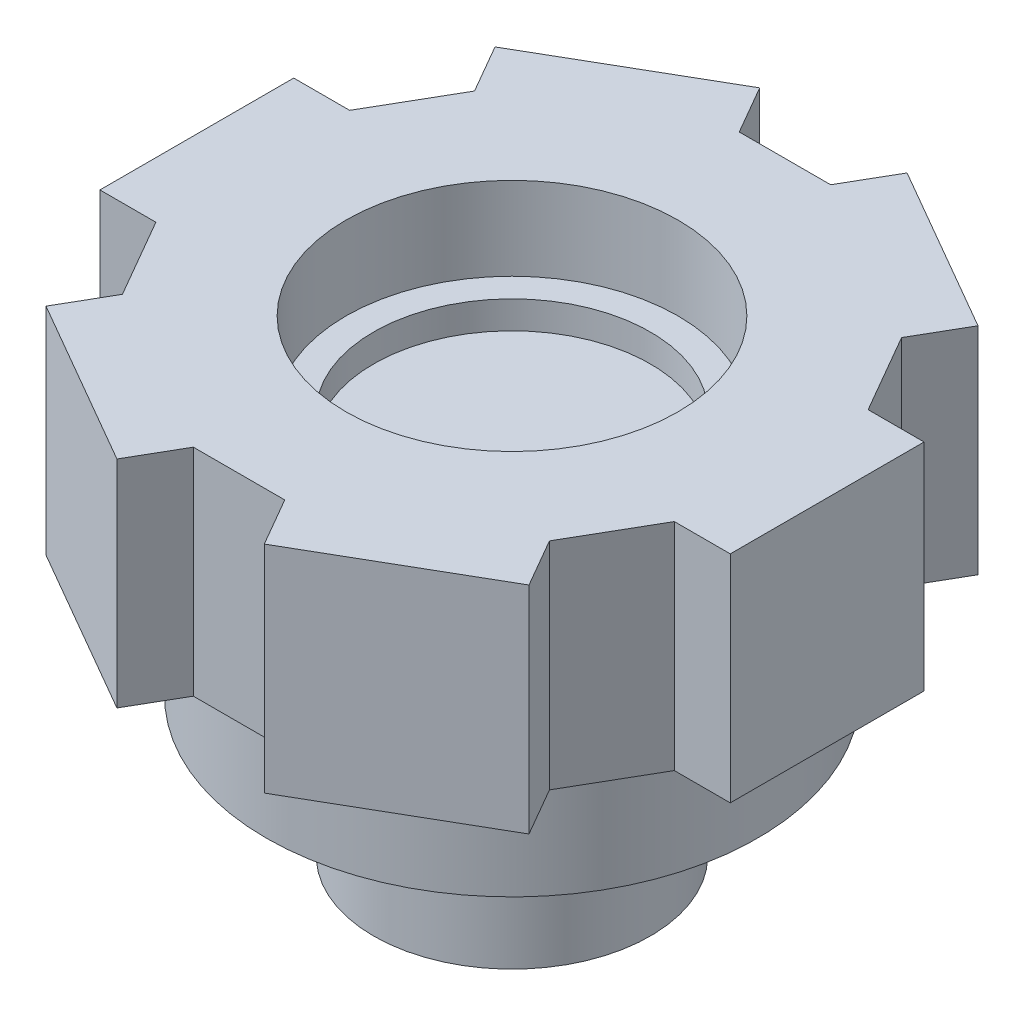
ISO-10303-21;
HEADER;
FILE_DESCRIPTION(('STEP AP214'),'2;1');
FILE_NAME('part.step','',(''),(''),'','','');
FILE_SCHEMA(('AUTOMOTIVE_DESIGN { 1 0 10303 214 1 1 1 1 }'));
ENDSEC;
DATA;
#1=APPLICATION_CONTEXT('core data for automotive mechanical design processes');
#2=APPLICATION_PROTOCOL_DEFINITION('international standard','automotive_design',2000,#1);
#3=PRODUCT_CONTEXT('',#1,'mechanical');
#4=PRODUCT('Part','Part','',(#3));
#5=PRODUCT_RELATED_PRODUCT_CATEGORY('part','',(#4));
#6=PRODUCT_DEFINITION_FORMATION('','',#4);
#7=PRODUCT_DEFINITION_CONTEXT('part definition',#1,'design');
#8=PRODUCT_DEFINITION('design','',#6,#7);
#9=PRODUCT_DEFINITION_SHAPE('','',#8);
#10=(LENGTH_UNIT() NAMED_UNIT(*) SI_UNIT(.MILLI.,.METRE.));
#11=(NAMED_UNIT(*) PLANE_ANGLE_UNIT() SI_UNIT($,.RADIAN.));
#12=(NAMED_UNIT(*) SI_UNIT($,.STERADIAN.) SOLID_ANGLE_UNIT());
#13=UNCERTAINTY_MEASURE_WITH_UNIT(LENGTH_MEASURE(1.E-05),#10,'distance_accuracy_value','');
#14=(GEOMETRIC_REPRESENTATION_CONTEXT(3) GLOBAL_UNCERTAINTY_ASSIGNED_CONTEXT((#13)) GLOBAL_UNIT_ASSIGNED_CONTEXT((#10,
#11,#12)) REPRESENTATION_CONTEXT('',''));
#15=CARTESIAN_POINT('',(0.,0.,0.));
#16=DIRECTION('',(0.,0.,1.));
#17=DIRECTION('',(1.,0.,0.));
#18=AXIS2_PLACEMENT_3D('',#15,#16,#17);
#19=CARTESIAN_POINT('',(0.,5.,0.));
#20=DIRECTION('',(0.,-1.,0.));
#21=DIRECTION('',(0.,0.,-1.));
#22=AXIS2_PLACEMENT_3D('',#19,#20,#21);
#23=CYLINDRICAL_SURFACE('',#22,5.);
#24=CARTESIAN_POINT('',(0.,5.,0.));
#25=DIRECTION('',(0.,1.,0.));
#26=DIRECTION('',(0.,0.,1.));
#27=AXIS2_PLACEMENT_3D('',#24,#25,#26);
#28=CIRCLE('',#27,5.);
#29=CARTESIAN_POINT('',(0.,5.,5.));
#30=VERTEX_POINT('',#29);
#31=EDGE_CURVE('E11',#30,#30,#28,.T.);
#32=ORIENTED_EDGE('',*,*,#31,.F.);
#33=EDGE_LOOP('',(#32));
#34=FACE_BOUND('',#33,.T.);
#35=CARTESIAN_POINT('',(0.,0.,0.));
#36=DIRECTION('',(0.,1.,0.));
#37=DIRECTION('',(0.,0.,1.));
#38=AXIS2_PLACEMENT_3D('',#35,#36,#37);
#39=CIRCLE('',#38,5.);
#40=CARTESIAN_POINT('',(0.,0.,5.));
#41=VERTEX_POINT('',#40);
#42=EDGE_CURVE('E36',#41,#41,#39,.T.);
#43=ORIENTED_EDGE('',*,*,#42,.T.);
#44=EDGE_LOOP('',(#43));
#45=FACE_BOUND('',#44,.T.);
#46=ADVANCED_FACE('F33',(#34,#45),#23,.T.);
#47=CARTESIAN_POINT('',(0.,0.,0.));
#48=DIRECTION('',(0.,1.,0.));
#49=DIRECTION('',(0.,0.,1.));
#50=AXIS2_PLACEMENT_3D('',#47,#48,#49);
#51=PLANE('',#50);
#52=ORIENTED_EDGE('',*,*,#42,.F.);
#53=EDGE_LOOP('',(#52));
#54=FACE_BOUND('',#53,.T.);
#55=ADVANCED_FACE('F357',(#54),#51,.F.);
#56=CARTESIAN_POINT('',(0.,9.11,0.));
#57=DIRECTION('',(0.,-1.,0.));
#58=DIRECTION('',(0.,0.,-1.));
#59=AXIS2_PLACEMENT_3D('',#56,#57,#58);
#60=CYLINDRICAL_SURFACE('',#59,8.875);
#61=CARTESIAN_POINT('',(0.,9.11,0.));
#62=DIRECTION('',(0.,1.,0.));
#63=DIRECTION('',(0.,0.,1.));
#64=AXIS2_PLACEMENT_3D('',#61,#62,#63);
#65=CIRCLE('',#64,8.875);
#66=CARTESIAN_POINT('',(0.,9.11,8.875));
#67=VERTEX_POINT('',#66);
#68=EDGE_CURVE('E337',#67,#67,#65,.T.);
#69=ORIENTED_EDGE('',*,*,#68,.F.);
#70=EDGE_LOOP('',(#69));
#71=FACE_BOUND('',#70,.T.);
#72=CARTESIAN_POINT('',(0.,5.,0.));
#73=DIRECTION('',(0.,1.,0.));
#74=DIRECTION('',(0.,0.,1.));
#75=AXIS2_PLACEMENT_3D('',#72,#73,#74);
#76=CIRCLE('',#75,8.875);
#77=CARTESIAN_POINT('',(0.,5.,8.875));
#78=VERTEX_POINT('',#77);
#79=EDGE_CURVE('E336',#78,#78,#76,.T.);
#80=ORIENTED_EDGE('',*,*,#79,.T.);
#81=EDGE_LOOP('',(#80));
#82=FACE_BOUND('',#81,.T.);
#83=ADVANCED_FACE('F343',(#71,#82),#60,.T.);
#84=CARTESIAN_POINT('',(0.,5.,0.));
#85=DIRECTION('',(0.,1.,0.));
#86=DIRECTION('',(0.,0.,1.));
#87=AXIS2_PLACEMENT_3D('',#84,#85,#86);
#88=PLANE('',#87);
#89=ORIENTED_EDGE('',*,*,#31,.T.);
#90=EDGE_LOOP('',(#89));
#91=FACE_BOUND('',#90,.T.);
#92=ORIENTED_EDGE('',*,*,#79,.F.);
#93=EDGE_LOOP('',(#92));
#94=FACE_BOUND('',#93,.T.);
#95=ADVANCED_FACE('F345',(#91,#94),#88,.F.);
#96=CARTESIAN_POINT('',(9.36427405783631,16.9,-3.5));
#97=DIRECTION('',(-0.866025403784439,0.,0.5));
#98=DIRECTION('',(0.5,0.,0.866025403784439));
#99=AXIS2_PLACEMENT_3D('',#96,#97,#98);
#100=PLANE('',#99);
#101=DIRECTION('',(-0.5,0.,-0.866025403784439));
#102=VECTOR('',#101,1.);
#103=CARTESIAN_POINT('',(9.36427405783631,9.11,-3.5));
#104=LINE('',#103,#102);
#105=CARTESIAN_POINT('',(9.36427405783631,9.11,-3.5));
#106=VERTEX_POINT('',#105);
#107=CARTESIAN_POINT('',(7.71322594216369,9.11,-6.35969922208584));
#108=VERTEX_POINT('',#107);
#109=EDGE_CURVE('E226',#106,#108,#104,.T.);
#110=ORIENTED_EDGE('',*,*,#109,.T.);
#111=DIRECTION('',(0.,-1.,0.));
#112=VECTOR('',#111,1.);
#113=CARTESIAN_POINT('',(7.71322594216369,16.9,-6.35969922208584));
#114=LINE('',#113,#112);
#115=CARTESIAN_POINT('',(7.71322594216369,16.9,-6.35969922208584));
#116=VERTEX_POINT('',#115);
#117=EDGE_CURVE('E334',#116,#108,#114,.T.);
#118=ORIENTED_EDGE('',*,*,#117,.F.);
#119=DIRECTION('',(-0.5,0.,-0.866025403784439));
#120=VECTOR('',#119,1.);
#121=CARTESIAN_POINT('',(9.36427405783631,16.9,-3.5));
#122=LINE('',#121,#120);
#123=CARTESIAN_POINT('',(9.36427405783631,16.9,-3.5));
#124=VERTEX_POINT('',#123);
#125=EDGE_CURVE('E273',#124,#116,#122,.T.);
#126=ORIENTED_EDGE('',*,*,#125,.F.);
#127=DIRECTION('',(0.,-1.,0.));
#128=VECTOR('',#127,1.);
#129=CARTESIAN_POINT('',(9.36427405783631,16.9,-3.5));
#130=LINE('',#129,#128);
#131=EDGE_CURVE('E222',#124,#106,#130,.T.);
#132=ORIENTED_EDGE('',*,*,#131,.T.);
#133=EDGE_LOOP('',(#110,#118,#126,#132));
#134=FACE_BOUND('',#133,.T.);
#135=ADVANCED_FACE('F347',(#134),#100,.F.);
#136=CARTESIAN_POINT('',(8.72358891324553,16.9,-8.10969922208584));
#137=DIRECTION('',(-0.866025403784438,0.,-0.5));
#138=DIRECTION('',(-0.5,0.,0.866025403784439));
#139=AXIS2_PLACEMENT_3D('',#136,#137,#138);
#140=PLANE('',#139);
#141=DIRECTION('',(0.5,0.,-0.866025403784438));
#142=VECTOR('',#141,1.);
#143=CARTESIAN_POINT('',(8.72358891324553,9.11,-8.10969922208584));
#144=LINE('',#143,#142);
#145=CARTESIAN_POINT('',(8.72358891324553,9.11,-8.10969922208584));
#146=VERTEX_POINT('',#145);
#147=EDGE_CURVE('E229',#108,#146,#144,.T.);
#148=ORIENTED_EDGE('',*,*,#147,.T.);
#149=DIRECTION('',(0.,-1.,0.));
#150=VECTOR('',#149,1.);
#151=CARTESIAN_POINT('',(8.72358891324553,16.9,-8.10969922208584));
#152=LINE('',#151,#150);
#153=CARTESIAN_POINT('',(8.72358891324553,16.9,-8.10969922208584));
#154=VERTEX_POINT('',#153);
#155=EDGE_CURVE('E331',#154,#146,#152,.T.);
#156=ORIENTED_EDGE('',*,*,#155,.F.);
#157=DIRECTION('',(0.5,0.,-0.866025403784438));
#158=VECTOR('',#157,1.);
#159=CARTESIAN_POINT('',(8.72358891324553,16.9,-8.10969922208584));
#160=LINE('',#159,#158);
#161=EDGE_CURVE('E141',#116,#154,#160,.T.);
#162=ORIENTED_EDGE('',*,*,#161,.F.);
#163=ORIENTED_EDGE('',*,*,#117,.T.);
#164=EDGE_LOOP('',(#148,#156,#162,#163));
#165=FACE_BOUND('',#164,.T.);
#166=ADVANCED_FACE('F354',(#165),#140,.F.);
#167=CARTESIAN_POINT('',(2.66141108675446,16.9,-11.6096992220858));
#168=DIRECTION('',(-0.499999999999999,0.,0.866025403784439));
#169=DIRECTION('',(0.866025403784439,0.,0.499999999999999));
#170=AXIS2_PLACEMENT_3D('',#167,#168,#169);
#171=PLANE('',#170);
#172=DIRECTION('',(-0.866025403784439,0.,-0.499999999999999));
#173=VECTOR('',#172,1.);
#174=CARTESIAN_POINT('',(2.66141108675446,9.11,-11.6096992220858));
#175=LINE('',#174,#173);
#176=CARTESIAN_POINT('',(2.66141108675446,9.11,-11.6096992220858));
#177=VERTEX_POINT('',#176);
#178=EDGE_CURVE('E232',#146,#177,#175,.T.);
#179=ORIENTED_EDGE('',*,*,#178,.T.);
#180=DIRECTION('',(0.,-1.,0.));
#181=VECTOR('',#180,1.);
#182=CARTESIAN_POINT('',(2.66141108675446,16.9,-11.6096992220858));
#183=LINE('',#182,#181);
#184=CARTESIAN_POINT('',(2.66141108675446,16.9,-11.6096992220858));
#185=VERTEX_POINT('',#184);
#186=EDGE_CURVE('E328',#185,#177,#183,.T.);
#187=ORIENTED_EDGE('',*,*,#186,.F.);
#188=DIRECTION('',(-0.866025403784439,0.,-0.499999999999999));
#189=VECTOR('',#188,1.);
#190=CARTESIAN_POINT('',(2.66141108675446,16.9,-11.6096992220858));
#191=LINE('',#190,#189);
#192=EDGE_CURVE('E687',#154,#185,#191,.T.);
#193=ORIENTED_EDGE('',*,*,#192,.F.);
#194=ORIENTED_EDGE('',*,*,#155,.T.);
#195=EDGE_LOOP('',(#179,#187,#193,#194));
#196=FACE_BOUND('',#195,.T.);
#197=ADVANCED_FACE('F395',(#196),#171,.F.);
#198=CARTESIAN_POINT('',(1.65104811567262,16.9,-9.85969922208584));
#199=DIRECTION('',(0.866025403784439,0.,0.499999999999999));
#200=DIRECTION('',(0.499999999999999,0.,-0.866025403784439));
#201=AXIS2_PLACEMENT_3D('',#198,#199,#200);
#202=PLANE('',#201);
#203=DIRECTION('',(-0.499999999999999,0.,0.866025403784439));
#204=VECTOR('',#203,1.);
#205=CARTESIAN_POINT('',(1.65104811567262,9.11,-9.85969922208584));
#206=LINE('',#205,#204);
#207=CARTESIAN_POINT('',(1.65104811567262,9.11,-9.85969922208584));
#208=VERTEX_POINT('',#207);
#209=EDGE_CURVE('E234',#177,#208,#206,.T.);
#210=ORIENTED_EDGE('',*,*,#209,.T.);
#211=DIRECTION('',(0.,-1.,0.));
#212=VECTOR('',#211,1.);
#213=CARTESIAN_POINT('',(1.65104811567262,16.9,-9.85969922208584));
#214=LINE('',#213,#212);
#215=CARTESIAN_POINT('',(1.65104811567262,16.9,-9.85969922208584));
#216=VERTEX_POINT('',#215);
#217=EDGE_CURVE('E325',#216,#208,#214,.T.);
#218=ORIENTED_EDGE('',*,*,#217,.F.);
#219=DIRECTION('',(-0.499999999999999,0.,0.866025403784439));
#220=VECTOR('',#219,1.);
#221=CARTESIAN_POINT('',(1.65104811567262,16.9,-9.85969922208584));
#222=LINE('',#221,#220);
#223=EDGE_CURVE('E689',#185,#216,#222,.T.);
#224=ORIENTED_EDGE('',*,*,#223,.F.);
#225=ORIENTED_EDGE('',*,*,#186,.T.);
#226=EDGE_LOOP('',(#210,#218,#224,#225));
#227=FACE_BOUND('',#226,.T.);
#228=ADVANCED_FACE('F404',(#227),#202,.F.);
#229=CARTESIAN_POINT('',(1.65104811567262,16.9,-9.85969922208584));
#230=DIRECTION('',(0.,0.,1.));
#231=DIRECTION('',(1.,0.,0.));
#232=AXIS2_PLACEMENT_3D('',#229,#230,#231);
#233=PLANE('',#232);
#234=DIRECTION('',(-1.,0.,0.));
#235=VECTOR('',#234,1.);
#236=CARTESIAN_POINT('',(1.65104811567262,9.11,-9.85969922208584));
#237=LINE('',#236,#235);
#238=CARTESIAN_POINT('',(-1.65104811567262,9.11,-9.85969922208584));
#239=VERTEX_POINT('',#238);
#240=EDGE_CURVE('E236',#208,#239,#237,.T.);
#241=ORIENTED_EDGE('',*,*,#240,.T.);
#242=DIRECTION('',(0.,-1.,0.));
#243=VECTOR('',#242,1.);
#244=CARTESIAN_POINT('',(-1.65104811567262,16.9,-9.85969922208584));
#245=LINE('',#244,#243);
#246=CARTESIAN_POINT('',(-1.65104811567262,16.9,-9.85969922208584));
#247=VERTEX_POINT('',#246);
#248=EDGE_CURVE('E322',#247,#239,#245,.T.);
#249=ORIENTED_EDGE('',*,*,#248,.F.);
#250=DIRECTION('',(-1.,0.,0.));
#251=VECTOR('',#250,1.);
#252=CARTESIAN_POINT('',(1.65104811567262,16.9,-9.85969922208584));
#253=LINE('',#252,#251);
#254=EDGE_CURVE('E691',#216,#247,#253,.T.);
#255=ORIENTED_EDGE('',*,*,#254,.F.);
#256=ORIENTED_EDGE('',*,*,#217,.T.);
#257=EDGE_LOOP('',(#241,#249,#255,#256));
#258=FACE_BOUND('',#257,.T.);
#259=ADVANCED_FACE('F414',(#258),#233,.F.);
#260=CARTESIAN_POINT('',(-2.66141108675446,16.9,-11.6096992220858));
#261=DIRECTION('',(-0.866025403784438,0.,0.5));
#262=DIRECTION('',(0.5,0.,0.866025403784438));
#263=AXIS2_PLACEMENT_3D('',#260,#261,#262);
#264=PLANE('',#263);
#265=DIRECTION('',(-0.5,0.,-0.866025403784438));
#266=VECTOR('',#265,1.);
#267=CARTESIAN_POINT('',(-2.66141108675446,9.11,-11.6096992220858));
#268=LINE('',#267,#266);
#269=CARTESIAN_POINT('',(-2.66141108675446,9.11,-11.6096992220858));
#270=VERTEX_POINT('',#269);
#271=EDGE_CURVE('E238',#239,#270,#268,.T.);
#272=ORIENTED_EDGE('',*,*,#271,.T.);
#273=DIRECTION('',(0.,-1.,0.));
#274=VECTOR('',#273,1.);
#275=CARTESIAN_POINT('',(-2.66141108675446,16.9,-11.6096992220858));
#276=LINE('',#275,#274);
#277=CARTESIAN_POINT('',(-2.66141108675446,16.9,-11.6096992220858));
#278=VERTEX_POINT('',#277);
#279=EDGE_CURVE('E319',#278,#270,#276,.T.);
#280=ORIENTED_EDGE('',*,*,#279,.F.);
#281=DIRECTION('',(-0.5,0.,-0.866025403784438));
#282=VECTOR('',#281,1.);
#283=CARTESIAN_POINT('',(-2.66141108675446,16.9,-11.6096992220858));
#284=LINE('',#283,#282);
#285=EDGE_CURVE('E693',#247,#278,#284,.T.);
#286=ORIENTED_EDGE('',*,*,#285,.F.);
#287=ORIENTED_EDGE('',*,*,#248,.T.);
#288=EDGE_LOOP('',(#272,#280,#286,#287));
#289=FACE_BOUND('',#288,.T.);
#290=ADVANCED_FACE('F424',(#289),#264,.F.);
#291=CARTESIAN_POINT('',(-8.72358891324553,16.9,-8.10969922208583));
#292=DIRECTION('',(0.5,0.,0.866025403784438));
#293=DIRECTION('',(0.866025403784438,0.,-0.5));
#294=AXIS2_PLACEMENT_3D('',#291,#292,#293);
#295=PLANE('',#294);
#296=DIRECTION('',(-0.866025403784438,0.,0.5));
#297=VECTOR('',#296,1.);
#298=CARTESIAN_POINT('',(-8.72358891324553,9.11,-8.10969922208583));
#299=LINE('',#298,#297);
#300=CARTESIAN_POINT('',(-8.72358891324553,9.11,-8.10969922208583));
#301=VERTEX_POINT('',#300);
#302=EDGE_CURVE('E240',#270,#301,#299,.T.);
#303=ORIENTED_EDGE('',*,*,#302,.T.);
#304=DIRECTION('',(0.,-1.,0.));
#305=VECTOR('',#304,1.);
#306=CARTESIAN_POINT('',(-8.72358891324553,16.9,-8.10969922208583));
#307=LINE('',#306,#305);
#308=CARTESIAN_POINT('',(-8.72358891324553,16.9,-8.10969922208583));
#309=VERTEX_POINT('',#308);
#310=EDGE_CURVE('E316',#309,#301,#307,.T.);
#311=ORIENTED_EDGE('',*,*,#310,.F.);
#312=DIRECTION('',(-0.866025403784438,0.,0.5));
#313=VECTOR('',#312,1.);
#314=CARTESIAN_POINT('',(-8.72358891324553,16.9,-8.10969922208583));
#315=LINE('',#314,#313);
#316=EDGE_CURVE('E695',#278,#309,#315,.T.);
#317=ORIENTED_EDGE('',*,*,#316,.F.);
#318=ORIENTED_EDGE('',*,*,#279,.T.);
#319=EDGE_LOOP('',(#303,#311,#317,#318));
#320=FACE_BOUND('',#319,.T.);
#321=ADVANCED_FACE('F434',(#320),#295,.F.);
#322=CARTESIAN_POINT('',(-7.71322594216369,16.9,-6.35969922208584));
#323=DIRECTION('',(0.866025403784438,0.,-0.500000000000001));
#324=DIRECTION('',(-0.500000000000001,0.,-0.866025403784438));
#325=AXIS2_PLACEMENT_3D('',#322,#323,#324);
#326=PLANE('',#325);
#327=DIRECTION('',(0.500000000000001,0.,0.866025403784438));
#328=VECTOR('',#327,1.);
#329=CARTESIAN_POINT('',(-7.71322594216369,9.11,-6.35969922208584));
#330=LINE('',#329,#328);
#331=CARTESIAN_POINT('',(-7.71322594216369,9.11,-6.35969922208584));
#332=VERTEX_POINT('',#331);
#333=EDGE_CURVE('E242',#301,#332,#330,.T.);
#334=ORIENTED_EDGE('',*,*,#333,.T.);
#335=DIRECTION('',(0.,-1.,0.));
#336=VECTOR('',#335,1.);
#337=CARTESIAN_POINT('',(-7.71322594216369,16.9,-6.35969922208584));
#338=LINE('',#337,#336);
#339=CARTESIAN_POINT('',(-7.71322594216369,16.9,-6.35969922208584));
#340=VERTEX_POINT('',#339);
#341=EDGE_CURVE('E313',#340,#332,#338,.T.);
#342=ORIENTED_EDGE('',*,*,#341,.F.);
#343=DIRECTION('',(0.500000000000001,0.,0.866025403784438));
#344=VECTOR('',#343,1.);
#345=CARTESIAN_POINT('',(-7.71322594216369,16.9,-6.35969922208584));
#346=LINE('',#345,#344);
#347=EDGE_CURVE('E697',#309,#340,#346,.T.);
#348=ORIENTED_EDGE('',*,*,#347,.F.);
#349=ORIENTED_EDGE('',*,*,#310,.T.);
#350=EDGE_LOOP('',(#334,#342,#348,#349));
#351=FACE_BOUND('',#350,.T.);
#352=ADVANCED_FACE('F444',(#351),#326,.F.);
#353=CARTESIAN_POINT('',(-7.71322594216369,16.9,-6.35969922208584));
#354=DIRECTION('',(0.866025403784439,0.,0.5));
#355=DIRECTION('',(0.5,0.,-0.866025403784439));
#356=AXIS2_PLACEMENT_3D('',#353,#354,#355);
#357=PLANE('',#356);
#358=DIRECTION('',(-0.5,0.,0.866025403784439));
#359=VECTOR('',#358,1.);
#360=CARTESIAN_POINT('',(-7.71322594216369,9.11,-6.35969922208584));
#361=LINE('',#360,#359);
#362=CARTESIAN_POINT('',(-9.36427405783631,9.11,-3.50000000000001));
#363=VERTEX_POINT('',#362);
#364=EDGE_CURVE('E244',#332,#363,#361,.T.);
#365=ORIENTED_EDGE('',*,*,#364,.T.);
#366=DIRECTION('',(0.,-1.,0.));
#367=VECTOR('',#366,1.);
#368=CARTESIAN_POINT('',(-9.36427405783631,16.9,-3.50000000000001));
#369=LINE('',#368,#367);
#370=CARTESIAN_POINT('',(-9.36427405783631,16.9,-3.50000000000001));
#371=VERTEX_POINT('',#370);
#372=EDGE_CURVE('E310',#371,#363,#369,.T.);
#373=ORIENTED_EDGE('',*,*,#372,.F.);
#374=DIRECTION('',(-0.5,0.,0.866025403784439));
#375=VECTOR('',#374,1.);
#376=CARTESIAN_POINT('',(-7.71322594216369,16.9,-6.35969922208584));
#377=LINE('',#376,#375);
#378=EDGE_CURVE('E699',#340,#371,#377,.T.);
#379=ORIENTED_EDGE('',*,*,#378,.F.);
#380=ORIENTED_EDGE('',*,*,#341,.T.);
#381=EDGE_LOOP('',(#365,#373,#379,#380));
#382=FACE_BOUND('',#381,.T.);
#383=ADVANCED_FACE('F454',(#382),#357,.F.);
#384=CARTESIAN_POINT('',(-11.385,16.9,-3.50000000000001));
#385=DIRECTION('',(0.,0.,1.));
#386=DIRECTION('',(1.,0.,0.));
#387=AXIS2_PLACEMENT_3D('',#384,#385,#386);
#388=PLANE('',#387);
#389=DIRECTION('',(-1.,0.,0.));
#390=VECTOR('',#389,1.);
#391=CARTESIAN_POINT('',(-11.385,9.11,-3.50000000000001));
#392=LINE('',#391,#390);
#393=CARTESIAN_POINT('',(-11.385,9.11,-3.50000000000001));
#394=VERTEX_POINT('',#393);
#395=EDGE_CURVE('E246',#363,#394,#392,.T.);
#396=ORIENTED_EDGE('',*,*,#395,.T.);
#397=DIRECTION('',(0.,-1.,0.));
#398=VECTOR('',#397,1.);
#399=CARTESIAN_POINT('',(-11.385,16.9,-3.50000000000001));
#400=LINE('',#399,#398);
#401=CARTESIAN_POINT('',(-11.385,16.9,-3.50000000000001));
#402=VERTEX_POINT('',#401);
#403=EDGE_CURVE('E307',#402,#394,#400,.T.);
#404=ORIENTED_EDGE('',*,*,#403,.F.);
#405=DIRECTION('',(-1.,0.,0.));
#406=VECTOR('',#405,1.);
#407=CARTESIAN_POINT('',(-11.385,16.9,-3.50000000000001));
#408=LINE('',#407,#406);
#409=EDGE_CURVE('E701',#371,#402,#408,.T.);
#410=ORIENTED_EDGE('',*,*,#409,.F.);
#411=ORIENTED_EDGE('',*,*,#372,.T.);
#412=EDGE_LOOP('',(#396,#404,#410,#411));
#413=FACE_BOUND('',#412,.T.);
#414=ADVANCED_FACE('F464',(#413),#388,.F.);
#415=CARTESIAN_POINT('',(-11.385,16.9,3.49999999999999));
#416=DIRECTION('',(1.,0.,0.));
#417=DIRECTION('',(0.,0.,-1.));
#418=AXIS2_PLACEMENT_3D('',#415,#416,#417);
#419=PLANE('',#418);
#420=DIRECTION('',(0.,0.,1.));
#421=VECTOR('',#420,1.);
#422=CARTESIAN_POINT('',(-11.385,9.11,3.49999999999999));
#423=LINE('',#422,#421);
#424=CARTESIAN_POINT('',(-11.385,9.11,3.49999999999999));
#425=VERTEX_POINT('',#424);
#426=EDGE_CURVE('E248',#394,#425,#423,.T.);
#427=ORIENTED_EDGE('',*,*,#426,.T.);
#428=DIRECTION('',(0.,-1.,0.));
#429=VECTOR('',#428,1.);
#430=CARTESIAN_POINT('',(-11.385,16.9,3.49999999999999));
#431=LINE('',#430,#429);
#432=CARTESIAN_POINT('',(-11.385,16.9,3.49999999999999));
#433=VERTEX_POINT('',#432);
#434=EDGE_CURVE('E304',#433,#425,#431,.T.);
#435=ORIENTED_EDGE('',*,*,#434,.F.);
#436=DIRECTION('',(0.,0.,1.));
#437=VECTOR('',#436,1.);
#438=CARTESIAN_POINT('',(-11.385,16.9,3.49999999999999));
#439=LINE('',#438,#437);
#440=EDGE_CURVE('E703',#402,#433,#439,.T.);
#441=ORIENTED_EDGE('',*,*,#440,.F.);
#442=ORIENTED_EDGE('',*,*,#403,.T.);
#443=EDGE_LOOP('',(#427,#435,#441,#442));
#444=FACE_BOUND('',#443,.T.);
#445=ADVANCED_FACE('F474',(#444),#419,.F.);
#446=CARTESIAN_POINT('',(-9.36427405783631,16.9,3.49999999999999));
#447=DIRECTION('',(0.,0.,-1.));
#448=DIRECTION('',(-1.,0.,0.));
#449=AXIS2_PLACEMENT_3D('',#446,#447,#448);
#450=PLANE('',#449);
#451=DIRECTION('',(1.,0.,0.));
#452=VECTOR('',#451,1.);
#453=CARTESIAN_POINT('',(-9.36427405783631,9.11,3.49999999999999));
#454=LINE('',#453,#452);
#455=CARTESIAN_POINT('',(-9.36427405783631,9.11,3.49999999999999));
#456=VERTEX_POINT('',#455);
#457=EDGE_CURVE('E250',#425,#456,#454,.T.);
#458=ORIENTED_EDGE('',*,*,#457,.T.);
#459=DIRECTION('',(0.,-1.,0.));
#460=VECTOR('',#459,1.);
#461=CARTESIAN_POINT('',(-9.36427405783631,16.9,3.49999999999999));
#462=LINE('',#461,#460);
#463=CARTESIAN_POINT('',(-9.36427405783631,16.9,3.49999999999999));
#464=VERTEX_POINT('',#463);
#465=EDGE_CURVE('E301',#464,#456,#462,.T.);
#466=ORIENTED_EDGE('',*,*,#465,.F.);
#467=DIRECTION('',(1.,0.,0.));
#468=VECTOR('',#467,1.);
#469=CARTESIAN_POINT('',(-9.36427405783631,16.9,3.49999999999999));
#470=LINE('',#469,#468);
#471=EDGE_CURVE('E705',#433,#464,#470,.T.);
#472=ORIENTED_EDGE('',*,*,#471,.F.);
#473=ORIENTED_EDGE('',*,*,#434,.T.);
#474=EDGE_LOOP('',(#458,#466,#472,#473));
#475=FACE_BOUND('',#474,.T.);
#476=ADVANCED_FACE('F484',(#475),#450,.F.);
#477=CARTESIAN_POINT('',(-9.36427405783631,16.9,3.49999999999999));
#478=DIRECTION('',(0.866025403784439,0.,-0.499999999999999));
#479=DIRECTION('',(-0.499999999999999,0.,-0.866025403784439));
#480=AXIS2_PLACEMENT_3D('',#477,#478,#479);
#481=PLANE('',#480);
#482=DIRECTION('',(0.499999999999999,0.,0.866025403784439));
#483=VECTOR('',#482,1.);
#484=CARTESIAN_POINT('',(-9.36427405783631,9.11,3.49999999999999));
#485=LINE('',#484,#483);
#486=CARTESIAN_POINT('',(-7.71322594216369,9.11,6.35969922208583));
#487=VERTEX_POINT('',#486);
#488=EDGE_CURVE('E252',#456,#487,#485,.T.);
#489=ORIENTED_EDGE('',*,*,#488,.T.);
#490=DIRECTION('',(0.,-1.,0.));
#491=VECTOR('',#490,1.);
#492=CARTESIAN_POINT('',(-7.71322594216369,16.9,6.35969922208583));
#493=LINE('',#492,#491);
#494=CARTESIAN_POINT('',(-7.71322594216369,16.9,6.35969922208583));
#495=VERTEX_POINT('',#494);
#496=EDGE_CURVE('E298',#495,#487,#493,.T.);
#497=ORIENTED_EDGE('',*,*,#496,.F.);
#498=DIRECTION('',(0.499999999999999,0.,0.866025403784439));
#499=VECTOR('',#498,1.);
#500=CARTESIAN_POINT('',(-9.36427405783631,16.9,3.49999999999999));
#501=LINE('',#500,#499);
#502=EDGE_CURVE('E707',#464,#495,#501,.T.);
#503=ORIENTED_EDGE('',*,*,#502,.F.);
#504=ORIENTED_EDGE('',*,*,#465,.T.);
#505=EDGE_LOOP('',(#489,#497,#503,#504));
#506=FACE_BOUND('',#505,.T.);
#507=ADVANCED_FACE('F494',(#506),#481,.F.);
#508=CARTESIAN_POINT('',(-8.72358891324553,16.9,8.10969922208583));
#509=DIRECTION('',(0.866025403784438,0.,0.5));
#510=DIRECTION('',(0.5,0.,-0.866025403784438));
#511=AXIS2_PLACEMENT_3D('',#508,#509,#510);
#512=PLANE('',#511);
#513=DIRECTION('',(-0.5,0.,0.866025403784438));
#514=VECTOR('',#513,1.);
#515=CARTESIAN_POINT('',(-8.72358891324553,9.11,8.10969922208583));
#516=LINE('',#515,#514);
#517=CARTESIAN_POINT('',(-8.72358891324553,9.11,8.10969922208583));
#518=VERTEX_POINT('',#517);
#519=EDGE_CURVE('E254',#487,#518,#516,.T.);
#520=ORIENTED_EDGE('',*,*,#519,.T.);
#521=DIRECTION('',(0.,-1.,0.));
#522=VECTOR('',#521,1.);
#523=CARTESIAN_POINT('',(-8.72358891324553,16.9,8.10969922208583));
#524=LINE('',#523,#522);
#525=CARTESIAN_POINT('',(-8.72358891324553,16.9,8.10969922208583));
#526=VERTEX_POINT('',#525);
#527=EDGE_CURVE('E295',#526,#518,#524,.T.);
#528=ORIENTED_EDGE('',*,*,#527,.F.);
#529=DIRECTION('',(-0.5,0.,0.866025403784438));
#530=VECTOR('',#529,1.);
#531=CARTESIAN_POINT('',(-8.72358891324553,16.9,8.10969922208583));
#532=LINE('',#531,#530);
#533=EDGE_CURVE('E709',#495,#526,#532,.T.);
#534=ORIENTED_EDGE('',*,*,#533,.F.);
#535=ORIENTED_EDGE('',*,*,#496,.T.);
#536=EDGE_LOOP('',(#520,#528,#534,#535));
#537=FACE_BOUND('',#536,.T.);
#538=ADVANCED_FACE('F504',(#537),#512,.F.);
#539=CARTESIAN_POINT('',(-2.66141108675446,16.9,11.6096992220858));
#540=DIRECTION('',(0.5,0.,-0.866025403784439));
#541=DIRECTION('',(-0.866025403784439,0.,-0.5));
#542=AXIS2_PLACEMENT_3D('',#539,#540,#541);
#543=PLANE('',#542);
#544=DIRECTION('',(0.866025403784439,0.,0.5));
#545=VECTOR('',#544,1.);
#546=CARTESIAN_POINT('',(-2.66141108675446,9.11,11.6096992220858));
#547=LINE('',#546,#545);
#548=CARTESIAN_POINT('',(-2.66141108675446,9.11,11.6096992220858));
#549=VERTEX_POINT('',#548);
#550=EDGE_CURVE('E256',#518,#549,#547,.T.);
#551=ORIENTED_EDGE('',*,*,#550,.T.);
#552=DIRECTION('',(0.,-1.,0.));
#553=VECTOR('',#552,1.);
#554=CARTESIAN_POINT('',(-2.66141108675446,16.9,11.6096992220858));
#555=LINE('',#554,#553);
#556=CARTESIAN_POINT('',(-2.66141108675446,16.9,11.6096992220858));
#557=VERTEX_POINT('',#556);
#558=EDGE_CURVE('E292',#557,#549,#555,.T.);
#559=ORIENTED_EDGE('',*,*,#558,.F.);
#560=DIRECTION('',(0.866025403784439,0.,0.5));
#561=VECTOR('',#560,1.);
#562=CARTESIAN_POINT('',(-2.66141108675446,16.9,11.6096992220858));
#563=LINE('',#562,#561);
#564=EDGE_CURVE('E711',#526,#557,#563,.T.);
#565=ORIENTED_EDGE('',*,*,#564,.F.);
#566=ORIENTED_EDGE('',*,*,#527,.T.);
#567=EDGE_LOOP('',(#551,#559,#565,#566));
#568=FACE_BOUND('',#567,.T.);
#569=ADVANCED_FACE('F514',(#568),#543,.F.);
#570=CARTESIAN_POINT('',(-1.65104811567262,16.9,9.85969922208583));
#571=DIRECTION('',(-0.866025403784439,0.,-0.5));
#572=DIRECTION('',(-0.5,0.,0.866025403784439));
#573=AXIS2_PLACEMENT_3D('',#570,#571,#572);
#574=PLANE('',#573);
#575=DIRECTION('',(0.5,0.,-0.866025403784439));
#576=VECTOR('',#575,1.);
#577=CARTESIAN_POINT('',(-1.65104811567262,9.11,9.85969922208583));
#578=LINE('',#577,#576);
#579=CARTESIAN_POINT('',(-1.65104811567262,9.11,9.85969922208583));
#580=VERTEX_POINT('',#579);
#581=EDGE_CURVE('E258',#549,#580,#578,.T.);
#582=ORIENTED_EDGE('',*,*,#581,.T.);
#583=DIRECTION('',(0.,-1.,0.));
#584=VECTOR('',#583,1.);
#585=CARTESIAN_POINT('',(-1.65104811567262,16.9,9.85969922208583));
#586=LINE('',#585,#584);
#587=CARTESIAN_POINT('',(-1.65104811567262,16.9,9.85969922208583));
#588=VERTEX_POINT('',#587);
#589=EDGE_CURVE('E289',#588,#580,#586,.T.);
#590=ORIENTED_EDGE('',*,*,#589,.F.);
#591=DIRECTION('',(0.5,0.,-0.866025403784439));
#592=VECTOR('',#591,1.);
#593=CARTESIAN_POINT('',(-1.65104811567262,16.9,9.85969922208583));
#594=LINE('',#593,#592);
#595=EDGE_CURVE('E713',#557,#588,#594,.T.);
#596=ORIENTED_EDGE('',*,*,#595,.F.);
#597=ORIENTED_EDGE('',*,*,#558,.T.);
#598=EDGE_LOOP('',(#582,#590,#596,#597));
#599=FACE_BOUND('',#598,.T.);
#600=ADVANCED_FACE('F524',(#599),#574,.F.);
#601=CARTESIAN_POINT('',(-1.65104811567262,16.9,9.85969922208583));
#602=DIRECTION('',(0.,0.,-1.));
#603=DIRECTION('',(-1.,0.,0.));
#604=AXIS2_PLACEMENT_3D('',#601,#602,#603);
#605=PLANE('',#604);
#606=DIRECTION('',(1.,0.,0.));
#607=VECTOR('',#606,1.);
#608=CARTESIAN_POINT('',(-1.65104811567262,9.11,9.85969922208583));
#609=LINE('',#608,#607);
#610=CARTESIAN_POINT('',(1.65104811567262,9.11,9.85969922208583));
#611=VERTEX_POINT('',#610);
#612=EDGE_CURVE('E260',#580,#611,#609,.T.);
#613=ORIENTED_EDGE('',*,*,#612,.T.);
#614=DIRECTION('',(0.,-1.,0.));
#615=VECTOR('',#614,1.);
#616=CARTESIAN_POINT('',(1.65104811567262,16.9,9.85969922208583));
#617=LINE('',#616,#615);
#618=CARTESIAN_POINT('',(1.65104811567262,16.9,9.85969922208583));
#619=VERTEX_POINT('',#618);
#620=EDGE_CURVE('E286',#619,#611,#617,.T.);
#621=ORIENTED_EDGE('',*,*,#620,.F.);
#622=DIRECTION('',(1.,0.,0.));
#623=VECTOR('',#622,1.);
#624=CARTESIAN_POINT('',(-1.65104811567262,16.9,9.85969922208583));
#625=LINE('',#624,#623);
#626=EDGE_CURVE('E715',#588,#619,#625,.T.);
#627=ORIENTED_EDGE('',*,*,#626,.F.);
#628=ORIENTED_EDGE('',*,*,#589,.T.);
#629=EDGE_LOOP('',(#613,#621,#627,#628));
#630=FACE_BOUND('',#629,.T.);
#631=ADVANCED_FACE('F534',(#630),#605,.F.);
#632=CARTESIAN_POINT('',(2.66141108675446,16.9,11.6096992220858));
#633=DIRECTION('',(0.866025403784439,0.,-0.5));
#634=DIRECTION('',(-0.5,0.,-0.866025403784439));
#635=AXIS2_PLACEMENT_3D('',#632,#633,#634);
#636=PLANE('',#635);
#637=DIRECTION('',(0.5,0.,0.866025403784439));
#638=VECTOR('',#637,1.);
#639=CARTESIAN_POINT('',(2.66141108675446,9.11,11.6096992220858));
#640=LINE('',#639,#638);
#641=CARTESIAN_POINT('',(2.66141108675446,9.11,11.6096992220858));
#642=VERTEX_POINT('',#641);
#643=EDGE_CURVE('E262',#611,#642,#640,.T.);
#644=ORIENTED_EDGE('',*,*,#643,.T.);
#645=DIRECTION('',(0.,-1.,0.));
#646=VECTOR('',#645,1.);
#647=CARTESIAN_POINT('',(2.66141108675446,16.9,11.6096992220858));
#648=LINE('',#647,#646);
#649=CARTESIAN_POINT('',(2.66141108675446,16.9,11.6096992220858));
#650=VERTEX_POINT('',#649);
#651=EDGE_CURVE('E283',#650,#642,#648,.T.);
#652=ORIENTED_EDGE('',*,*,#651,.F.);
#653=DIRECTION('',(0.5,0.,0.866025403784439));
#654=VECTOR('',#653,1.);
#655=CARTESIAN_POINT('',(2.66141108675446,16.9,11.6096992220858));
#656=LINE('',#655,#654);
#657=EDGE_CURVE('E717',#619,#650,#656,.T.);
#658=ORIENTED_EDGE('',*,*,#657,.F.);
#659=ORIENTED_EDGE('',*,*,#620,.T.);
#660=EDGE_LOOP('',(#644,#652,#658,#659));
#661=FACE_BOUND('',#660,.T.);
#662=ADVANCED_FACE('F544',(#661),#636,.F.);
#663=CARTESIAN_POINT('',(8.72358891324553,16.9,8.10969922208583));
#664=DIRECTION('',(-0.5,0.,-0.866025403784439));
#665=DIRECTION('',(-0.866025403784439,0.,0.5));
#666=AXIS2_PLACEMENT_3D('',#663,#664,#665);
#667=PLANE('',#666);
#668=DIRECTION('',(0.866025403784439,0.,-0.5));
#669=VECTOR('',#668,1.);
#670=CARTESIAN_POINT('',(8.72358891324553,9.11,8.10969922208583));
#671=LINE('',#670,#669);
#672=CARTESIAN_POINT('',(8.72358891324553,9.11,8.10969922208583));
#673=VERTEX_POINT('',#672);
#674=EDGE_CURVE('E264',#642,#673,#671,.T.);
#675=ORIENTED_EDGE('',*,*,#674,.T.);
#676=DIRECTION('',(0.,-1.,0.));
#677=VECTOR('',#676,1.);
#678=CARTESIAN_POINT('',(8.72358891324553,16.9,8.10969922208583));
#679=LINE('',#678,#677);
#680=CARTESIAN_POINT('',(8.72358891324553,16.9,8.10969922208583));
#681=VERTEX_POINT('',#680);
#682=EDGE_CURVE('E280',#681,#673,#679,.T.);
#683=ORIENTED_EDGE('',*,*,#682,.F.);
#684=DIRECTION('',(0.866025403784439,0.,-0.5));
#685=VECTOR('',#684,1.);
#686=CARTESIAN_POINT('',(8.72358891324553,16.9,8.10969922208583));
#687=LINE('',#686,#685);
#688=EDGE_CURVE('E719',#650,#681,#687,.T.);
#689=ORIENTED_EDGE('',*,*,#688,.F.);
#690=ORIENTED_EDGE('',*,*,#651,.T.);
#691=EDGE_LOOP('',(#675,#683,#689,#690));
#692=FACE_BOUND('',#691,.T.);
#693=ADVANCED_FACE('F554',(#692),#667,.F.);
#694=CARTESIAN_POINT('',(7.71322594216369,16.9,6.35969922208583));
#695=DIRECTION('',(-0.866025403784439,0.,0.5));
#696=DIRECTION('',(0.5,0.,0.866025403784439));
#697=AXIS2_PLACEMENT_3D('',#694,#695,#696);
#698=PLANE('',#697);
#699=DIRECTION('',(-0.5,0.,-0.866025403784439));
#700=VECTOR('',#699,1.);
#701=CARTESIAN_POINT('',(7.71322594216369,9.11,6.35969922208583));
#702=LINE('',#701,#700);
#703=CARTESIAN_POINT('',(7.71322594216369,9.11,6.35969922208583));
#704=VERTEX_POINT('',#703);
#705=EDGE_CURVE('E266',#673,#704,#702,.T.);
#706=ORIENTED_EDGE('',*,*,#705,.T.);
#707=DIRECTION('',(0.,-1.,0.));
#708=VECTOR('',#707,1.);
#709=CARTESIAN_POINT('',(7.71322594216369,16.9,6.35969922208583));
#710=LINE('',#709,#708);
#711=CARTESIAN_POINT('',(7.71322594216369,16.9,6.35969922208583));
#712=VERTEX_POINT('',#711);
#713=EDGE_CURVE('E277',#712,#704,#710,.T.);
#714=ORIENTED_EDGE('',*,*,#713,.F.);
#715=DIRECTION('',(-0.5,0.,-0.866025403784439));
#716=VECTOR('',#715,1.);
#717=CARTESIAN_POINT('',(7.71322594216369,16.9,6.35969922208583));
#718=LINE('',#717,#716);
#719=EDGE_CURVE('E721',#681,#712,#718,.T.);
#720=ORIENTED_EDGE('',*,*,#719,.F.);
#721=ORIENTED_EDGE('',*,*,#682,.T.);
#722=EDGE_LOOP('',(#706,#714,#720,#721));
#723=FACE_BOUND('',#722,.T.);
#724=ADVANCED_FACE('F564',(#723),#698,.F.);
#725=CARTESIAN_POINT('',(7.71322594216369,16.9,6.35969922208583));
#726=DIRECTION('',(-0.866025403784438,0.,-0.500000000000001));
#727=DIRECTION('',(-0.500000000000001,0.,0.866025403784438));
#728=AXIS2_PLACEMENT_3D('',#725,#726,#727);
#729=PLANE('',#728);
#730=DIRECTION('',(0.500000000000001,0.,-0.866025403784438));
#731=VECTOR('',#730,1.);
#732=CARTESIAN_POINT('',(7.71322594216369,9.11,6.35969922208583));
#733=LINE('',#732,#731);
#734=CARTESIAN_POINT('',(9.36427405783631,9.11,3.5));
#735=VERTEX_POINT('',#734);
#736=EDGE_CURVE('E268',#704,#735,#733,.T.);
#737=ORIENTED_EDGE('',*,*,#736,.T.);
#738=DIRECTION('',(0.,-1.,0.));
#739=VECTOR('',#738,1.);
#740=CARTESIAN_POINT('',(9.36427405783631,16.9,3.5));
#741=LINE('',#740,#739);
#742=CARTESIAN_POINT('',(9.36427405783631,16.9,3.5));
#743=VERTEX_POINT('',#742);
#744=EDGE_CURVE('E217',#743,#735,#741,.T.);
#745=ORIENTED_EDGE('',*,*,#744,.F.);
#746=DIRECTION('',(0.500000000000001,0.,-0.866025403784438));
#747=VECTOR('',#746,1.);
#748=CARTESIAN_POINT('',(7.71322594216369,16.9,6.35969922208583));
#749=LINE('',#748,#747);
#750=EDGE_CURVE('E208',#712,#743,#749,.T.);
#751=ORIENTED_EDGE('',*,*,#750,.F.);
#752=ORIENTED_EDGE('',*,*,#713,.T.);
#753=EDGE_LOOP('',(#737,#745,#751,#752));
#754=FACE_BOUND('',#753,.T.);
#755=ADVANCED_FACE('F574',(#754),#729,.F.);
#756=CARTESIAN_POINT('',(11.385,16.9,3.5));
#757=DIRECTION('',(0.,0.,-1.));
#758=DIRECTION('',(-1.,0.,0.));
#759=AXIS2_PLACEMENT_3D('',#756,#757,#758);
#760=PLANE('',#759);
#761=DIRECTION('',(1.,0.,0.));
#762=VECTOR('',#761,1.);
#763=CARTESIAN_POINT('',(11.385,9.11,3.5));
#764=LINE('',#763,#762);
#765=CARTESIAN_POINT('',(11.385,9.11,3.5));
#766=VERTEX_POINT('',#765);
#767=EDGE_CURVE('E216',#735,#766,#764,.T.);
#768=ORIENTED_EDGE('',*,*,#767,.T.);
#769=DIRECTION('',(0.,-1.,0.));
#770=VECTOR('',#769,1.);
#771=CARTESIAN_POINT('',(11.385,16.9,3.5));
#772=LINE('',#771,#770);
#773=CARTESIAN_POINT('',(11.385,16.9,3.5));
#774=VERTEX_POINT('',#773);
#775=EDGE_CURVE('E213',#774,#766,#772,.T.);
#776=ORIENTED_EDGE('',*,*,#775,.F.);
#777=DIRECTION('',(1.,0.,0.));
#778=VECTOR('',#777,1.);
#779=CARTESIAN_POINT('',(11.385,16.9,3.5));
#780=LINE('',#779,#778);
#781=EDGE_CURVE('E202',#743,#774,#780,.T.);
#782=ORIENTED_EDGE('',*,*,#781,.F.);
#783=ORIENTED_EDGE('',*,*,#744,.T.);
#784=EDGE_LOOP('',(#768,#776,#782,#783));
#785=FACE_BOUND('',#784,.T.);
#786=ADVANCED_FACE('F214',(#785),#760,.F.);
#787=CARTESIAN_POINT('',(11.385,16.9,-3.5));
#788=DIRECTION('',(-1.,0.,0.));
#789=DIRECTION('',(0.,0.,1.));
#790=AXIS2_PLACEMENT_3D('',#787,#788,#789);
#791=PLANE('',#790);
#792=DIRECTION('',(0.,0.,-1.));
#793=VECTOR('',#792,1.);
#794=CARTESIAN_POINT('',(11.385,9.11,-3.5));
#795=LINE('',#794,#793);
#796=CARTESIAN_POINT('',(11.385,9.11,-3.5));
#797=VERTEX_POINT('',#796);
#798=EDGE_CURVE('E126',#766,#797,#795,.T.);
#799=ORIENTED_EDGE('',*,*,#798,.T.);
#800=DIRECTION('',(0.,-1.,0.));
#801=VECTOR('',#800,1.);
#802=CARTESIAN_POINT('',(11.385,16.9,-3.5));
#803=LINE('',#802,#801);
#804=CARTESIAN_POINT('',(11.385,16.9,-3.5));
#805=VERTEX_POINT('',#804);
#806=EDGE_CURVE('E218',#805,#797,#803,.T.);
#807=ORIENTED_EDGE('',*,*,#806,.F.);
#808=DIRECTION('',(0.,0.,-1.));
#809=VECTOR('',#808,1.);
#810=CARTESIAN_POINT('',(11.385,16.9,-3.5));
#811=LINE('',#810,#809);
#812=EDGE_CURVE('E206',#774,#805,#811,.T.);
#813=ORIENTED_EDGE('',*,*,#812,.F.);
#814=ORIENTED_EDGE('',*,*,#775,.T.);
#815=EDGE_LOOP('',(#799,#807,#813,#814));
#816=FACE_BOUND('',#815,.T.);
#817=ADVANCED_FACE('F220',(#816),#791,.F.);
#818=CARTESIAN_POINT('',(9.36427405783631,16.9,-3.5));
#819=DIRECTION('',(0.,0.,1.));
#820=DIRECTION('',(1.,0.,0.));
#821=AXIS2_PLACEMENT_3D('',#818,#819,#820);
#822=PLANE('',#821);
#823=DIRECTION('',(-1.,0.,0.));
#824=VECTOR('',#823,1.);
#825=CARTESIAN_POINT('',(9.36427405783631,9.11,-3.5));
#826=LINE('',#825,#824);
#827=EDGE_CURVE('E132',#797,#106,#826,.T.);
#828=ORIENTED_EDGE('',*,*,#827,.T.);
#829=ORIENTED_EDGE('',*,*,#131,.F.);
#830=DIRECTION('',(-1.,0.,0.));
#831=VECTOR('',#830,1.);
#832=CARTESIAN_POINT('',(9.36427405783631,16.9,-3.5));
#833=LINE('',#832,#831);
#834=EDGE_CURVE('E49',#805,#124,#833,.T.);
#835=ORIENTED_EDGE('',*,*,#834,.F.);
#836=ORIENTED_EDGE('',*,*,#806,.T.);
#837=EDGE_LOOP('',(#828,#829,#835,#836));
#838=FACE_BOUND('',#837,.T.);
#839=ADVANCED_FACE('F601',(#838),#822,.F.);
#840=CARTESIAN_POINT('',(0.,16.9,0.));
#841=DIRECTION('',(0.,-1.,0.));
#842=DIRECTION('',(0.,0.,-1.));
#843=AXIS2_PLACEMENT_3D('',#840,#841,#842);
#844=PLANE('',#843);
#845=CARTESIAN_POINT('',(0.,16.9,0.));
#846=DIRECTION('',(0.,1.,0.));
#847=DIRECTION('',(0.,0.,1.));
#848=AXIS2_PLACEMENT_3D('',#845,#846,#847);
#849=CIRCLE('',#848,6.);
#850=CARTESIAN_POINT('',(0.,16.9,6.));
#851=VERTEX_POINT('',#850);
#852=EDGE_CURVE('E675',#851,#851,#849,.T.);
#853=ORIENTED_EDGE('',*,*,#852,.F.);
#854=EDGE_LOOP('',(#853));
#855=FACE_BOUND('',#854,.T.);
#856=ORIENTED_EDGE('',*,*,#125,.T.);
#857=ORIENTED_EDGE('',*,*,#161,.T.);
#858=ORIENTED_EDGE('',*,*,#192,.T.);
#859=ORIENTED_EDGE('',*,*,#223,.T.);
#860=ORIENTED_EDGE('',*,*,#254,.T.);
#861=ORIENTED_EDGE('',*,*,#285,.T.);
#862=ORIENTED_EDGE('',*,*,#316,.T.);
#863=ORIENTED_EDGE('',*,*,#347,.T.);
#864=ORIENTED_EDGE('',*,*,#378,.T.);
#865=ORIENTED_EDGE('',*,*,#409,.T.);
#866=ORIENTED_EDGE('',*,*,#440,.T.);
#867=ORIENTED_EDGE('',*,*,#471,.T.);
#868=ORIENTED_EDGE('',*,*,#502,.T.);
#869=ORIENTED_EDGE('',*,*,#533,.T.);
#870=ORIENTED_EDGE('',*,*,#564,.T.);
#871=ORIENTED_EDGE('',*,*,#595,.T.);
#872=ORIENTED_EDGE('',*,*,#626,.T.);
#873=ORIENTED_EDGE('',*,*,#657,.T.);
#874=ORIENTED_EDGE('',*,*,#688,.T.);
#875=ORIENTED_EDGE('',*,*,#719,.T.);
#876=ORIENTED_EDGE('',*,*,#750,.T.);
#877=ORIENTED_EDGE('',*,*,#781,.T.);
#878=ORIENTED_EDGE('',*,*,#812,.T.);
#879=ORIENTED_EDGE('',*,*,#834,.T.);
#880=EDGE_LOOP('',(#856,#857,#858,#859,#860,#861,#862,#863,#864,#865,#866,#867,#868,#869,#870,
#871,#872,#873,#874,#875,#876,#877,#878,#879));
#881=FACE_BOUND('',#880,.T.);
#882=ADVANCED_FACE('F204',(#855,#881),#844,.F.);
#883=CARTESIAN_POINT('',(0.,9.11,0.));
#884=DIRECTION('',(0.,-1.,0.));
#885=DIRECTION('',(0.,0.,-1.));
#886=AXIS2_PLACEMENT_3D('',#883,#884,#885);
#887=PLANE('',#886);
#888=ORIENTED_EDGE('',*,*,#68,.T.);
#889=EDGE_LOOP('',(#888));
#890=FACE_BOUND('',#889,.T.);
#891=ORIENTED_EDGE('',*,*,#109,.F.);
#892=ORIENTED_EDGE('',*,*,#827,.F.);
#893=ORIENTED_EDGE('',*,*,#798,.F.);
#894=ORIENTED_EDGE('',*,*,#767,.F.);
#895=ORIENTED_EDGE('',*,*,#736,.F.);
#896=ORIENTED_EDGE('',*,*,#705,.F.);
#897=ORIENTED_EDGE('',*,*,#674,.F.);
#898=ORIENTED_EDGE('',*,*,#643,.F.);
#899=ORIENTED_EDGE('',*,*,#612,.F.);
#900=ORIENTED_EDGE('',*,*,#581,.F.);
#901=ORIENTED_EDGE('',*,*,#550,.F.);
#902=ORIENTED_EDGE('',*,*,#519,.F.);
#903=ORIENTED_EDGE('',*,*,#488,.F.);
#904=ORIENTED_EDGE('',*,*,#457,.F.);
#905=ORIENTED_EDGE('',*,*,#426,.F.);
#906=ORIENTED_EDGE('',*,*,#395,.F.);
#907=ORIENTED_EDGE('',*,*,#364,.F.);
#908=ORIENTED_EDGE('',*,*,#333,.F.);
#909=ORIENTED_EDGE('',*,*,#302,.F.);
#910=ORIENTED_EDGE('',*,*,#271,.F.);
#911=ORIENTED_EDGE('',*,*,#240,.F.);
#912=ORIENTED_EDGE('',*,*,#209,.F.);
#913=ORIENTED_EDGE('',*,*,#178,.F.);
#914=ORIENTED_EDGE('',*,*,#147,.F.);
#915=EDGE_LOOP('',(#891,#892,#893,#894,#895,#896,#897,#898,#899,#900,#901,#902,#903,#904,#905,
#906,#907,#908,#909,#910,#911,#912,#913,#914));
#916=FACE_BOUND('',#915,.T.);
#917=ADVANCED_FACE('F616',(#890,#916),#887,.T.);
#918=CARTESIAN_POINT('',(0.,13.9,0.));
#919=DIRECTION('',(0.,1.,0.));
#920=DIRECTION('',(0.,0.,1.));
#921=AXIS2_PLACEMENT_3D('',#918,#919,#920);
#922=CYLINDRICAL_SURFACE('',#921,6.);
#923=CARTESIAN_POINT('',(0.,13.9,0.));
#924=DIRECTION('',(0.,1.,0.));
#925=DIRECTION('',(0.,0.,1.));
#926=AXIS2_PLACEMENT_3D('',#923,#924,#925);
#927=CIRCLE('',#926,6.);
#928=CARTESIAN_POINT('',(0.,13.9,6.));
#929=VERTEX_POINT('',#928);
#930=EDGE_CURVE('E230',#929,#929,#927,.T.);
#931=ORIENTED_EDGE('',*,*,#930,.F.);
#932=EDGE_LOOP('',(#931));
#933=FACE_BOUND('',#932,.T.);
#934=ORIENTED_EDGE('',*,*,#852,.T.);
#935=EDGE_LOOP('',(#934));
#936=FACE_BOUND('',#935,.T.);
#937=ADVANCED_FACE('F621',(#933,#936),#922,.F.);
#938=CARTESIAN_POINT('',(0.,13.9,0.));
#939=DIRECTION('',(0.,1.,0.));
#940=DIRECTION('',(0.,0.,1.));
#941=AXIS2_PLACEMENT_3D('',#938,#939,#940);
#942=PLANE('',#941);
#943=CARTESIAN_POINT('',(0.,13.9,0.));
#944=DIRECTION('',(0.,1.,0.));
#945=DIRECTION('',(0.,0.,1.));
#946=AXIS2_PLACEMENT_3D('',#943,#944,#945);
#947=CIRCLE('',#946,5.);
#948=CARTESIAN_POINT('',(0.,13.9,5.));
#949=VERTEX_POINT('',#948);
#950=EDGE_CURVE('E676',#949,#949,#947,.T.);
#951=ORIENTED_EDGE('',*,*,#950,.F.);
#952=EDGE_LOOP('',(#951));
#953=FACE_BOUND('',#952,.T.);
#954=ORIENTED_EDGE('',*,*,#930,.T.);
#955=EDGE_LOOP('',(#954));
#956=FACE_BOUND('',#955,.T.);
#957=ADVANCED_FACE('F638',(#953,#956),#942,.T.);
#958=CARTESIAN_POINT('',(0.,12.9,0.));
#959=DIRECTION('',(0.,1.,0.));
#960=DIRECTION('',(0.,0.,1.));
#961=AXIS2_PLACEMENT_3D('',#958,#959,#960);
#962=CYLINDRICAL_SURFACE('',#961,5.);
#963=CARTESIAN_POINT('',(0.,12.9,0.));
#964=DIRECTION('',(0.,1.,0.));
#965=DIRECTION('',(0.,0.,1.));
#966=AXIS2_PLACEMENT_3D('',#963,#964,#965);
#967=CIRCLE('',#966,5.);
#968=CARTESIAN_POINT('',(0.,12.9,5.));
#969=VERTEX_POINT('',#968);
#970=EDGE_CURVE('E674',#969,#969,#967,.T.);
#971=ORIENTED_EDGE('',*,*,#970,.F.);
#972=EDGE_LOOP('',(#971));
#973=FACE_BOUND('',#972,.T.);
#974=ORIENTED_EDGE('',*,*,#950,.T.);
#975=EDGE_LOOP('',(#974));
#976=FACE_BOUND('',#975,.T.);
#977=ADVANCED_FACE('F648',(#973,#976),#962,.F.);
#978=CARTESIAN_POINT('',(0.,12.9,0.));
#979=DIRECTION('',(0.,1.,0.));
#980=DIRECTION('',(0.,0.,1.));
#981=AXIS2_PLACEMENT_3D('',#978,#979,#980);
#982=PLANE('',#981);
#983=ORIENTED_EDGE('',*,*,#970,.T.);
#984=EDGE_LOOP('',(#983));
#985=FACE_BOUND('',#984,.T.);
#986=ADVANCED_FACE('F658',(#985),#982,.T.);
#987=CLOSED_SHELL('',(#46,#55,#83,#95,#135,#166,#197,#228,#259,#290,#321,#352,#383,#414,#445,
#476,#507,#538,#569,#600,#631,#662,#693,#724,#755,#786,#817,#839,#882,#917,#937,#957,#977,#986));
#988=MANIFOLD_SOLID_BREP('B2',#987);
#989=ADVANCED_BREP_SHAPE_REPRESENTATION('',(#18,#988),#14);
#990=SHAPE_DEFINITION_REPRESENTATION(#9,#989);
ENDSEC;
END-ISO-10303-21;
